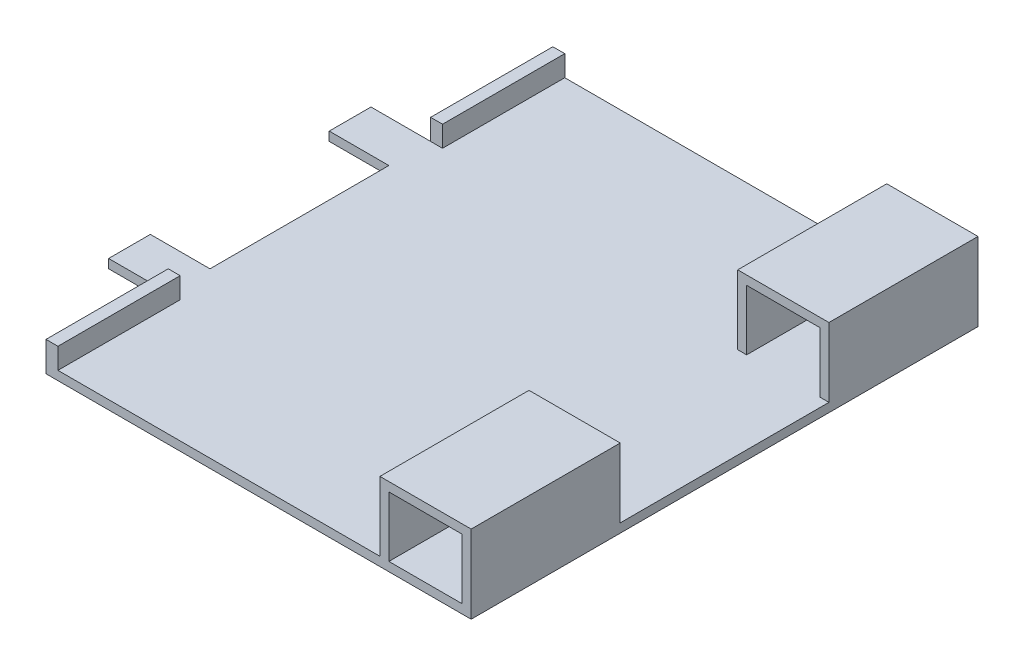
ISO-10303-21;
HEADER;
FILE_DESCRIPTION(('STEP AP214'),'2;1');
FILE_NAME('part.step','',(''),(''),'','','');
FILE_SCHEMA(('AUTOMOTIVE_DESIGN { 1 0 10303 214 1 1 1 1 }'));
ENDSEC;
DATA;
#1=APPLICATION_CONTEXT('core data for automotive mechanical design processes');
#2=APPLICATION_PROTOCOL_DEFINITION('international standard','automotive_design',2000,#1);
#3=PRODUCT_CONTEXT('',#1,'mechanical');
#4=PRODUCT('Part','Part','',(#3));
#5=PRODUCT_RELATED_PRODUCT_CATEGORY('part','',(#4));
#6=PRODUCT_DEFINITION_FORMATION('','',#4);
#7=PRODUCT_DEFINITION_CONTEXT('part definition',#1,'design');
#8=PRODUCT_DEFINITION('design','',#6,#7);
#9=PRODUCT_DEFINITION_SHAPE('','',#8);
#10=(LENGTH_UNIT() NAMED_UNIT(*) SI_UNIT(.MILLI.,.METRE.));
#11=(NAMED_UNIT(*) PLANE_ANGLE_UNIT() SI_UNIT($,.RADIAN.));
#12=(NAMED_UNIT(*) SI_UNIT($,.STERADIAN.) SOLID_ANGLE_UNIT());
#13=UNCERTAINTY_MEASURE_WITH_UNIT(LENGTH_MEASURE(1.E-05),#10,'distance_accuracy_value','');
#14=(GEOMETRIC_REPRESENTATION_CONTEXT(3) GLOBAL_UNCERTAINTY_ASSIGNED_CONTEXT((#13)) GLOBAL_UNIT_ASSIGNED_CONTEXT((#10,
#11,#12)) REPRESENTATION_CONTEXT('',''));
#15=CARTESIAN_POINT('',(0.,0.,0.));
#16=DIRECTION('',(0.,0.,1.));
#17=DIRECTION('',(1.,0.,0.));
#18=AXIS2_PLACEMENT_3D('',#15,#16,#17);
#19=CARTESIAN_POINT('',(0.,1.5,-5.49999999999999));
#20=DIRECTION('',(0.,0.,1.));
#21=DIRECTION('',(1.,0.,0.));
#22=AXIS2_PLACEMENT_3D('',#19,#20,#21);
#23=PLANE('',#22);
#24=DIRECTION('',(-1.,0.,0.));
#25=VECTOR('',#24,1.);
#26=CARTESIAN_POINT('',(0.,0.,-5.49999999999999));
#27=LINE('',#26,#25);
#28=CARTESIAN_POINT('',(-6.49999999999999,0.,-5.49999999999999));
#29=VERTEX_POINT('',#28);
#30=CARTESIAN_POINT('',(-16.5,0.,-5.5));
#31=VERTEX_POINT('',#30);
#32=EDGE_CURVE('E480',#29,#31,#27,.T.);
#33=ORIENTED_EDGE('',*,*,#32,.F.);
#34=DIRECTION('',(0.,-1.,0.));
#35=VECTOR('',#34,1.);
#36=CARTESIAN_POINT('',(-6.49999999999999,5.,-5.49999999999999));
#37=LINE('',#36,#35);
#38=CARTESIAN_POINT('',(-6.49999999999999,1.5,-5.49999999999999));
#39=VERTEX_POINT('',#38);
#40=EDGE_CURVE('E447',#39,#29,#37,.T.);
#41=ORIENTED_EDGE('',*,*,#40,.F.);
#42=DIRECTION('',(-1.,0.,0.));
#43=VECTOR('',#42,1.);
#44=CARTESIAN_POINT('',(0.,1.5,-5.49999999999999));
#45=LINE('',#44,#43);
#46=CARTESIAN_POINT('',(-16.5,1.5,-5.5));
#47=VERTEX_POINT('',#46);
#48=EDGE_CURVE('E510',#39,#47,#45,.T.);
#49=ORIENTED_EDGE('',*,*,#48,.T.);
#50=DIRECTION('',(0.,-1.,0.));
#51=VECTOR('',#50,1.);
#52=CARTESIAN_POINT('',(-16.5,1.5,-5.5));
#53=LINE('',#52,#51);
#54=EDGE_CURVE('E466',#47,#31,#53,.T.);
#55=ORIENTED_EDGE('',*,*,#54,.T.);
#56=EDGE_LOOP('',(#33,#41,#49,#55));
#57=FACE_BOUND('',#56,.T.);
#58=ADVANCED_FACE('F47',(#57),#23,.T.);
#59=CARTESIAN_POINT('',(0.,1.5,-49.5));
#60=DIRECTION('',(0.,0.,1.));
#61=DIRECTION('',(1.,0.,0.));
#62=AXIS2_PLACEMENT_3D('',#59,#60,#61);
#63=PLANE('',#62);
#64=DIRECTION('',(0.,-1.,0.));
#65=VECTOR('',#64,1.);
#66=CARTESIAN_POINT('',(-6.5,5.,-49.5));
#67=LINE('',#66,#65);
#68=CARTESIAN_POINT('',(-6.5,1.5,-49.5));
#69=VERTEX_POINT('',#68);
#70=CARTESIAN_POINT('',(-6.5,0.,-49.5));
#71=VERTEX_POINT('',#70);
#72=EDGE_CURVE('E69',#69,#71,#67,.T.);
#73=ORIENTED_EDGE('',*,*,#72,.T.);
#74=DIRECTION('',(-1.,0.,0.));
#75=VECTOR('',#74,1.);
#76=CARTESIAN_POINT('',(0.,0.,-49.5));
#77=LINE('',#76,#75);
#78=CARTESIAN_POINT('',(-16.5,0.,-49.5));
#79=VERTEX_POINT('',#78);
#80=EDGE_CURVE('E572',#71,#79,#77,.T.);
#81=ORIENTED_EDGE('',*,*,#80,.T.);
#82=DIRECTION('',(0.,-1.,0.));
#83=VECTOR('',#82,1.);
#84=CARTESIAN_POINT('',(-16.5,1.5,-49.5));
#85=LINE('',#84,#83);
#86=CARTESIAN_POINT('',(-16.5,1.5,-49.5));
#87=VERTEX_POINT('',#86);
#88=EDGE_CURVE('E476',#87,#79,#85,.T.);
#89=ORIENTED_EDGE('',*,*,#88,.F.);
#90=DIRECTION('',(-1.,0.,0.));
#91=VECTOR('',#90,1.);
#92=CARTESIAN_POINT('',(0.,1.5,-49.5));
#93=LINE('',#92,#91);
#94=EDGE_CURVE('E64',#69,#87,#93,.T.);
#95=ORIENTED_EDGE('',*,*,#94,.F.);
#96=EDGE_LOOP('',(#73,#81,#89,#95));
#97=FACE_BOUND('',#96,.T.);
#98=ADVANCED_FACE('F656',(#97),#63,.F.);
#99=CARTESIAN_POINT('',(-6.49999999999999,1.5,0.));
#100=DIRECTION('',(1.,0.,0.));
#101=DIRECTION('',(0.,0.,-1.));
#102=AXIS2_PLACEMENT_3D('',#99,#100,#101);
#103=PLANE('',#102);
#104=DIRECTION('',(0.,0.,1.));
#105=VECTOR('',#104,1.);
#106=CARTESIAN_POINT('',(-6.49999999999999,1.5,0.));
#107=LINE('',#106,#105);
#108=CARTESIAN_POINT('',(-6.5,1.5,-42.5));
#109=VERTEX_POINT('',#108);
#110=CARTESIAN_POINT('',(-6.5,1.5,-12.5));
#111=VERTEX_POINT('',#110);
#112=EDGE_CURVE('E11',#109,#111,#107,.T.);
#113=ORIENTED_EDGE('',*,*,#112,.F.);
#114=DIRECTION('',(0.,-1.,0.));
#115=VECTOR('',#114,1.);
#116=CARTESIAN_POINT('',(-6.5,1.5,-42.5));
#117=LINE('',#116,#115);
#118=CARTESIAN_POINT('',(-6.5,0.,-42.5));
#119=VERTEX_POINT('',#118);
#120=EDGE_CURVE('E462',#109,#119,#117,.T.);
#121=ORIENTED_EDGE('',*,*,#120,.T.);
#122=DIRECTION('',(0.,0.,1.));
#123=VECTOR('',#122,1.);
#124=CARTESIAN_POINT('',(-6.49999999999999,0.,0.));
#125=LINE('',#124,#123);
#126=CARTESIAN_POINT('',(-6.5,0.,-12.5));
#127=VERTEX_POINT('',#126);
#128=EDGE_CURVE('E50',#119,#127,#125,.T.);
#129=ORIENTED_EDGE('',*,*,#128,.T.);
#130=DIRECTION('',(0.,-1.,0.));
#131=VECTOR('',#130,1.);
#132=CARTESIAN_POINT('',(-6.5,1.5,-12.5));
#133=LINE('',#132,#131);
#134=EDGE_CURVE('E499',#111,#127,#133,.T.);
#135=ORIENTED_EDGE('',*,*,#134,.F.);
#136=EDGE_LOOP('',(#113,#121,#129,#135));
#137=FACE_BOUND('',#136,.T.);
#138=ADVANCED_FACE('F661',(#137),#103,.F.);
#139=CARTESIAN_POINT('',(0.,1.5,15.));
#140=DIRECTION('',(0.,0.,-1.));
#141=DIRECTION('',(-1.,0.,0.));
#142=AXIS2_PLACEMENT_3D('',#139,#140,#141);
#143=PLANE('',#142);
#144=DIRECTION('',(0.,-1.,0.));
#145=VECTOR('',#144,1.);
#146=CARTESIAN_POINT('',(51.,11.6,15.));
#147=LINE('',#146,#145);
#148=CARTESIAN_POINT('',(51.,11.6,15.));
#149=VERTEX_POINT('',#148);
#150=CARTESIAN_POINT('',(51.,1.5,15.));
#151=VERTEX_POINT('',#150);
#152=EDGE_CURVE('E375',#149,#151,#147,.T.);
#153=ORIENTED_EDGE('',*,*,#152,.F.);
#154=DIRECTION('',(1.,0.,0.));
#155=VECTOR('',#154,1.);
#156=CARTESIAN_POINT('',(49.5,11.6,15.));
#157=LINE('',#156,#155);
#158=CARTESIAN_POINT('',(63.3,11.6,15.));
#159=VERTEX_POINT('',#158);
#160=EDGE_CURVE('E294',#149,#159,#157,.T.);
#161=ORIENTED_EDGE('',*,*,#160,.T.);
#162=DIRECTION('',(0.,-1.,0.));
#163=VECTOR('',#162,1.);
#164=CARTESIAN_POINT('',(63.3,11.6,15.));
#165=LINE('',#164,#163);
#166=CARTESIAN_POINT('',(63.3,1.5,15.));
#167=VERTEX_POINT('',#166);
#168=EDGE_CURVE('E332',#159,#167,#165,.T.);
#169=ORIENTED_EDGE('',*,*,#168,.T.);
#170=DIRECTION('',(1.,0.,0.));
#171=VECTOR('',#170,1.);
#172=CARTESIAN_POINT('',(0.,1.5,15.));
#173=LINE('',#172,#171);
#174=EDGE_CURVE('E518',#151,#167,#173,.T.);
#175=ORIENTED_EDGE('',*,*,#174,.F.);
#176=EDGE_LOOP('',(#153,#161,#169,#175));
#177=FACE_BOUND('',#176,.T.);
#178=DIRECTION('',(1.,0.,0.));
#179=VECTOR('',#178,1.);
#180=CARTESIAN_POINT('',(0.,0.,15.));
#181=LINE('',#180,#179);
#182=CARTESIAN_POINT('',(-6.49999999999999,0.,15.));
#183=VERTEX_POINT('',#182);
#184=CARTESIAN_POINT('',(64.8,0.,15.));
#185=VERTEX_POINT('',#184);
#186=EDGE_CURVE('E563',#183,#185,#181,.T.);
#187=ORIENTED_EDGE('',*,*,#186,.T.);
#188=DIRECTION('',(0.,-1.,0.));
#189=VECTOR('',#188,1.);
#190=CARTESIAN_POINT('',(64.8,11.6,15.));
#191=LINE('',#190,#189);
#192=CARTESIAN_POINT('',(64.8,13.1,15.));
#193=VERTEX_POINT('',#192);
#194=EDGE_CURVE('E328',#193,#185,#191,.T.);
#195=ORIENTED_EDGE('',*,*,#194,.F.);
#196=DIRECTION('',(1.,0.,0.));
#197=VECTOR('',#196,1.);
#198=CARTESIAN_POINT('',(49.5,13.1,15.));
#199=LINE('',#198,#197);
#200=CARTESIAN_POINT('',(49.5,13.1,15.));
#201=VERTEX_POINT('',#200);
#202=EDGE_CURVE('E312',#201,#193,#199,.T.);
#203=ORIENTED_EDGE('',*,*,#202,.F.);
#204=DIRECTION('',(0.,-1.,0.));
#205=VECTOR('',#204,1.);
#206=CARTESIAN_POINT('',(49.5,11.6,15.));
#207=LINE('',#206,#205);
#208=CARTESIAN_POINT('',(49.5,1.5,15.));
#209=VERTEX_POINT('',#208);
#210=EDGE_CURVE('E378',#201,#209,#207,.T.);
#211=ORIENTED_EDGE('',*,*,#210,.T.);
#212=CARTESIAN_POINT('',(-4.49999999999999,1.5,15.));
#213=VERTEX_POINT('',#212);
#214=EDGE_CURVE('E513',#213,#209,#173,.T.);
#215=ORIENTED_EDGE('',*,*,#214,.F.);
#216=DIRECTION('',(0.,-1.,0.));
#217=VECTOR('',#216,1.);
#218=CARTESIAN_POINT('',(-4.49999999999999,5.,15.));
#219=LINE('',#218,#217);
#220=CARTESIAN_POINT('',(-4.49999999999999,5.,15.));
#221=VERTEX_POINT('',#220);
#222=EDGE_CURVE('E437',#221,#213,#219,.T.);
#223=ORIENTED_EDGE('',*,*,#222,.F.);
#224=DIRECTION('',(1.,0.,0.));
#225=VECTOR('',#224,1.);
#226=CARTESIAN_POINT('',(0.,5.,15.));
#227=LINE('',#226,#225);
#228=CARTESIAN_POINT('',(-6.49999999999999,5.,15.));
#229=VERTEX_POINT('',#228);
#230=EDGE_CURVE('E434',#229,#221,#227,.T.);
#231=ORIENTED_EDGE('',*,*,#230,.F.);
#232=DIRECTION('',(0.,-1.,0.));
#233=VECTOR('',#232,1.);
#234=CARTESIAN_POINT('',(-6.49999999999999,5.,15.));
#235=LINE('',#234,#233);
#236=EDGE_CURVE('E443',#229,#183,#235,.T.);
#237=ORIENTED_EDGE('',*,*,#236,.T.);
#238=EDGE_LOOP('',(#187,#195,#203,#211,#215,#223,#231,#237));
#239=FACE_BOUND('',#238,.T.);
#240=ADVANCED_FACE('F617',(#177,#239),#143,.F.);
#241=CARTESIAN_POINT('',(64.8,1.5,0.));
#242=DIRECTION('',(1.,0.,0.));
#243=DIRECTION('',(0.,0.,-1.));
#244=AXIS2_PLACEMENT_3D('',#241,#242,#243);
#245=PLANE('',#244);
#246=DIRECTION('',(0.,0.,1.));
#247=VECTOR('',#246,1.);
#248=CARTESIAN_POINT('',(64.8,0.,0.));
#249=LINE('',#248,#247);
#250=CARTESIAN_POINT('',(64.8,0.,-70.));
#251=VERTEX_POINT('',#250);
#252=EDGE_CURVE('E567',#251,#185,#249,.T.);
#253=ORIENTED_EDGE('',*,*,#252,.F.);
#254=DIRECTION('',(0.,-1.,0.));
#255=VECTOR('',#254,1.);
#256=CARTESIAN_POINT('',(64.8,11.6,-70.));
#257=LINE('',#256,#255);
#258=CARTESIAN_POINT('',(64.8,13.1,-70.));
#259=VERTEX_POINT('',#258);
#260=EDGE_CURVE('E346',#259,#251,#257,.T.);
#261=ORIENTED_EDGE('',*,*,#260,.F.);
#262=DIRECTION('',(0.,0.,-1.));
#263=VECTOR('',#262,1.);
#264=CARTESIAN_POINT('',(64.8,13.1,-70.));
#265=LINE('',#264,#263);
#266=CARTESIAN_POINT('',(64.8,13.1,-45.));
#267=VERTEX_POINT('',#266);
#268=EDGE_CURVE('E274',#267,#259,#265,.T.);
#269=ORIENTED_EDGE('',*,*,#268,.F.);
#270=DIRECTION('',(0.,-1.,0.));
#271=VECTOR('',#270,1.);
#272=CARTESIAN_POINT('',(64.8,11.6,-45.));
#273=LINE('',#272,#271);
#274=CARTESIAN_POINT('',(64.8,1.5,-45.));
#275=VERTEX_POINT('',#274);
#276=EDGE_CURVE('E269',#267,#275,#273,.T.);
#277=ORIENTED_EDGE('',*,*,#276,.T.);
#278=DIRECTION('',(0.,0.,1.));
#279=VECTOR('',#278,1.);
#280=CARTESIAN_POINT('',(64.8,1.5,0.));
#281=LINE('',#280,#279);
#282=CARTESIAN_POINT('',(64.8,1.5,-10.));
#283=VERTEX_POINT('',#282);
#284=EDGE_CURVE('E533',#275,#283,#281,.T.);
#285=ORIENTED_EDGE('',*,*,#284,.T.);
#286=DIRECTION('',(0.,-1.,0.));
#287=VECTOR('',#286,1.);
#288=CARTESIAN_POINT('',(64.8,11.6,-10.));
#289=LINE('',#288,#287);
#290=CARTESIAN_POINT('',(64.8,13.1,-10.));
#291=VERTEX_POINT('',#290);
#292=EDGE_CURVE('E323',#291,#283,#289,.T.);
#293=ORIENTED_EDGE('',*,*,#292,.F.);
#294=DIRECTION('',(0.,0.,-1.));
#295=VECTOR('',#294,1.);
#296=CARTESIAN_POINT('',(64.8,13.1,-10.));
#297=LINE('',#296,#295);
#298=EDGE_CURVE('E308',#193,#291,#297,.T.);
#299=ORIENTED_EDGE('',*,*,#298,.F.);
#300=ORIENTED_EDGE('',*,*,#194,.T.);
#301=EDGE_LOOP('',(#253,#261,#269,#277,#285,#293,#299,#300));
#302=FACE_BOUND('',#301,.T.);
#303=ADVANCED_FACE('F645',(#302),#245,.T.);
#304=CARTESIAN_POINT('',(0.,1.5,-70.));
#305=DIRECTION('',(0.,0.,-1.));
#306=DIRECTION('',(-1.,0.,0.));
#307=AXIS2_PLACEMENT_3D('',#304,#305,#306);
#308=PLANE('',#307);
#309=DIRECTION('',(-1.,0.,0.));
#310=VECTOR('',#309,1.);
#311=CARTESIAN_POINT('',(49.5,13.1,-70.));
#312=LINE('',#311,#310);
#313=CARTESIAN_POINT('',(49.5,13.1,-70.));
#314=VERTEX_POINT('',#313);
#315=EDGE_CURVE('E279',#259,#314,#312,.T.);
#316=ORIENTED_EDGE('',*,*,#315,.F.);
#317=ORIENTED_EDGE('',*,*,#260,.T.);
#318=DIRECTION('',(1.,0.,0.));
#319=VECTOR('',#318,1.);
#320=CARTESIAN_POINT('',(0.,0.,-70.));
#321=LINE('',#320,#319);
#322=CARTESIAN_POINT('',(-6.5,0.,-70.));
#323=VERTEX_POINT('',#322);
#324=EDGE_CURVE('E570',#323,#251,#321,.T.);
#325=ORIENTED_EDGE('',*,*,#324,.F.);
#326=DIRECTION('',(0.,-1.,0.));
#327=VECTOR('',#326,1.);
#328=CARTESIAN_POINT('',(-6.5,5.,-70.));
#329=LINE('',#328,#327);
#330=CARTESIAN_POINT('',(-6.5,5.,-70.));
#331=VERTEX_POINT('',#330);
#332=EDGE_CURVE('E411',#331,#323,#329,.T.);
#333=ORIENTED_EDGE('',*,*,#332,.F.);
#334=DIRECTION('',(1.,0.,0.));
#335=VECTOR('',#334,1.);
#336=CARTESIAN_POINT('',(0.,5.,-70.));
#337=LINE('',#336,#335);
#338=CARTESIAN_POINT('',(-4.49999999999999,5.,-70.));
#339=VERTEX_POINT('',#338);
#340=EDGE_CURVE('E396',#331,#339,#337,.T.);
#341=ORIENTED_EDGE('',*,*,#340,.T.);
#342=DIRECTION('',(0.,-1.,0.));
#343=VECTOR('',#342,1.);
#344=CARTESIAN_POINT('',(-4.49999999999999,5.,-70.));
#345=LINE('',#344,#343);
#346=CARTESIAN_POINT('',(-4.49999999999999,1.5,-70.));
#347=VERTEX_POINT('',#346);
#348=EDGE_CURVE('E415',#339,#347,#345,.T.);
#349=ORIENTED_EDGE('',*,*,#348,.T.);
#350=DIRECTION('',(1.,0.,0.));
#351=VECTOR('',#350,1.);
#352=CARTESIAN_POINT('',(0.,1.5,-70.));
#353=LINE('',#352,#351);
#354=CARTESIAN_POINT('',(49.5,1.5,-70.));
#355=VERTEX_POINT('',#354);
#356=EDGE_CURVE('E548',#347,#355,#353,.T.);
#357=ORIENTED_EDGE('',*,*,#356,.T.);
#358=DIRECTION('',(0.,-1.,0.));
#359=VECTOR('',#358,1.);
#360=CARTESIAN_POINT('',(49.5,11.6,-70.));
#361=LINE('',#360,#359);
#362=EDGE_CURVE('E358',#314,#355,#361,.T.);
#363=ORIENTED_EDGE('',*,*,#362,.F.);
#364=EDGE_LOOP('',(#316,#317,#325,#333,#341,#349,#357,#363));
#365=FACE_BOUND('',#364,.T.);
#366=DIRECTION('',(0.,-1.,0.));
#367=VECTOR('',#366,1.);
#368=CARTESIAN_POINT('',(63.3,11.6,-70.));
#369=LINE('',#368,#367);
#370=CARTESIAN_POINT('',(63.3,11.6,-70.));
#371=VERTEX_POINT('',#370);
#372=CARTESIAN_POINT('',(63.3,1.5,-70.));
#373=VERTEX_POINT('',#372);
#374=EDGE_CURVE('E343',#371,#373,#369,.T.);
#375=ORIENTED_EDGE('',*,*,#374,.F.);
#376=DIRECTION('',(-1.,0.,0.));
#377=VECTOR('',#376,1.);
#378=CARTESIAN_POINT('',(49.5,11.6,-70.));
#379=LINE('',#378,#377);
#380=CARTESIAN_POINT('',(51.,11.6,-70.));
#381=VERTEX_POINT('',#380);
#382=EDGE_CURVE('E281',#371,#381,#379,.T.);
#383=ORIENTED_EDGE('',*,*,#382,.T.);
#384=DIRECTION('',(0.,-1.,0.));
#385=VECTOR('',#384,1.);
#386=CARTESIAN_POINT('',(51.,11.6,-70.));
#387=LINE('',#386,#385);
#388=CARTESIAN_POINT('',(51.,1.5,-70.));
#389=VERTEX_POINT('',#388);
#390=EDGE_CURVE('E361',#381,#389,#387,.T.);
#391=ORIENTED_EDGE('',*,*,#390,.T.);
#392=EDGE_CURVE('E543',#389,#373,#353,.T.);
#393=ORIENTED_EDGE('',*,*,#392,.T.);
#394=EDGE_LOOP('',(#375,#383,#391,#393));
#395=FACE_BOUND('',#394,.T.);
#396=ADVANCED_FACE('F670',(#365,#395),#308,.T.);
#397=CARTESIAN_POINT('',(0.,1.5,0.));
#398=DIRECTION('',(0.,1.,0.));
#399=DIRECTION('',(0.,0.,1.));
#400=AXIS2_PLACEMENT_3D('',#397,#398,#399);
#401=PLANE('',#400);
#402=CARTESIAN_POINT('',(-4.49999999999999,1.5,-5.49999999999999));
#403=VERTEX_POINT('',#402);
#404=EDGE_CURVE('E506',#403,#39,#45,.T.);
#405=ORIENTED_EDGE('',*,*,#404,.F.);
#406=DIRECTION('',(0.,0.,-1.));
#407=VECTOR('',#406,1.);
#408=CARTESIAN_POINT('',(-4.49999999999999,1.5,0.));
#409=LINE('',#408,#407);
#410=EDGE_CURVE('E509',#213,#403,#409,.T.);
#411=ORIENTED_EDGE('',*,*,#410,.F.);
#412=ORIENTED_EDGE('',*,*,#214,.T.);
#413=DIRECTION('',(0.,0.,1.));
#414=VECTOR('',#413,1.);
#415=CARTESIAN_POINT('',(49.5,1.5,0.));
#416=LINE('',#415,#414);
#417=CARTESIAN_POINT('',(49.5,1.5,-10.));
#418=VERTEX_POINT('',#417);
#419=EDGE_CURVE('E517',#418,#209,#416,.T.);
#420=ORIENTED_EDGE('',*,*,#419,.F.);
#421=DIRECTION('',(-1.,0.,0.));
#422=VECTOR('',#421,1.);
#423=CARTESIAN_POINT('',(0.,1.5,-10.));
#424=LINE('',#423,#422);
#425=CARTESIAN_POINT('',(51.,1.5,-10.));
#426=VERTEX_POINT('',#425);
#427=EDGE_CURVE('E521',#426,#418,#424,.T.);
#428=ORIENTED_EDGE('',*,*,#427,.F.);
#429=DIRECTION('',(0.,0.,-1.));
#430=VECTOR('',#429,1.);
#431=CARTESIAN_POINT('',(51.,1.5,0.));
#432=LINE('',#431,#430);
#433=EDGE_CURVE('E524',#151,#426,#432,.T.);
#434=ORIENTED_EDGE('',*,*,#433,.F.);
#435=ORIENTED_EDGE('',*,*,#174,.T.);
#436=DIRECTION('',(0.,0.,-1.));
#437=VECTOR('',#436,1.);
#438=CARTESIAN_POINT('',(63.3,1.5,0.));
#439=LINE('',#438,#437);
#440=CARTESIAN_POINT('',(63.3,1.5,-10.));
#441=VERTEX_POINT('',#440);
#442=EDGE_CURVE('E527',#167,#441,#439,.T.);
#443=ORIENTED_EDGE('',*,*,#442,.T.);
#444=DIRECTION('',(1.,0.,0.));
#445=VECTOR('',#444,1.);
#446=CARTESIAN_POINT('',(0.,1.5,-10.));
#447=LINE('',#446,#445);
#448=EDGE_CURVE('E530',#441,#283,#447,.T.);
#449=ORIENTED_EDGE('',*,*,#448,.T.);
#450=ORIENTED_EDGE('',*,*,#284,.F.);
#451=DIRECTION('',(1.,0.,0.));
#452=VECTOR('',#451,1.);
#453=CARTESIAN_POINT('',(0.,1.5,-45.));
#454=LINE('',#453,#452);
#455=CARTESIAN_POINT('',(63.3,1.5,-45.));
#456=VERTEX_POINT('',#455);
#457=EDGE_CURVE('E537',#456,#275,#454,.T.);
#458=ORIENTED_EDGE('',*,*,#457,.F.);
#459=DIRECTION('',(0.,0.,1.));
#460=VECTOR('',#459,1.);
#461=CARTESIAN_POINT('',(63.3,1.5,0.));
#462=LINE('',#461,#460);
#463=EDGE_CURVE('E540',#373,#456,#462,.T.);
#464=ORIENTED_EDGE('',*,*,#463,.F.);
#465=ORIENTED_EDGE('',*,*,#392,.F.);
#466=DIRECTION('',(0.,0.,1.));
#467=VECTOR('',#466,1.);
#468=CARTESIAN_POINT('',(51.,1.5,0.));
#469=LINE('',#468,#467);
#470=CARTESIAN_POINT('',(51.,1.5,-45.));
#471=VERTEX_POINT('',#470);
#472=EDGE_CURVE('E547',#389,#471,#469,.T.);
#473=ORIENTED_EDGE('',*,*,#472,.T.);
#474=DIRECTION('',(1.,0.,0.));
#475=VECTOR('',#474,1.);
#476=CARTESIAN_POINT('',(0.,1.5,-45.));
#477=LINE('',#476,#475);
#478=CARTESIAN_POINT('',(49.5,1.5,-45.));
#479=VERTEX_POINT('',#478);
#480=EDGE_CURVE('E551',#479,#471,#477,.T.);
#481=ORIENTED_EDGE('',*,*,#480,.F.);
#482=DIRECTION('',(0.,0.,1.));
#483=VECTOR('',#482,1.);
#484=CARTESIAN_POINT('',(49.5,1.5,0.));
#485=LINE('',#484,#483);
#486=EDGE_CURVE('E258',#355,#479,#485,.T.);
#487=ORIENTED_EDGE('',*,*,#486,.F.);
#488=ORIENTED_EDGE('',*,*,#356,.F.);
#489=DIRECTION('',(0.,0.,1.));
#490=VECTOR('',#489,1.);
#491=CARTESIAN_POINT('',(-4.49999999999998,1.5,0.));
#492=LINE('',#491,#490);
#493=CARTESIAN_POINT('',(-4.49999999999999,1.5,-49.5));
#494=VERTEX_POINT('',#493);
#495=EDGE_CURVE('E556',#347,#494,#492,.T.);
#496=ORIENTED_EDGE('',*,*,#495,.T.);
#497=EDGE_CURVE('E56',#494,#69,#93,.T.);
#498=ORIENTED_EDGE('',*,*,#497,.T.);
#499=ORIENTED_EDGE('',*,*,#94,.T.);
#500=DIRECTION('',(0.,0.,1.));
#501=VECTOR('',#500,1.);
#502=CARTESIAN_POINT('',(-16.5,1.5,0.));
#503=LINE('',#502,#501);
#504=CARTESIAN_POINT('',(-16.5,1.5,-42.5));
#505=VERTEX_POINT('',#504);
#506=EDGE_CURVE('E455',#87,#505,#503,.T.);
#507=ORIENTED_EDGE('',*,*,#506,.T.);
#508=DIRECTION('',(1.,0.,0.));
#509=VECTOR('',#508,1.);
#510=CARTESIAN_POINT('',(0.,1.5,-42.5));
#511=LINE('',#510,#509);
#512=EDGE_CURVE('E458',#505,#109,#511,.T.);
#513=ORIENTED_EDGE('',*,*,#512,.T.);
#514=ORIENTED_EDGE('',*,*,#112,.T.);
#515=DIRECTION('',(1.,0.,0.));
#516=VECTOR('',#515,1.);
#517=CARTESIAN_POINT('',(0.,1.5,-12.5));
#518=LINE('',#517,#516);
#519=CARTESIAN_POINT('',(-16.5,1.5,-12.5));
#520=VERTEX_POINT('',#519);
#521=EDGE_CURVE('E485',#520,#111,#518,.T.);
#522=ORIENTED_EDGE('',*,*,#521,.F.);
#523=DIRECTION('',(0.,0.,-1.));
#524=VECTOR('',#523,1.);
#525=CARTESIAN_POINT('',(-16.5,1.5,0.));
#526=LINE('',#525,#524);
#527=EDGE_CURVE('E481',#47,#520,#526,.T.);
#528=ORIENTED_EDGE('',*,*,#527,.F.);
#529=ORIENTED_EDGE('',*,*,#48,.F.);
#530=EDGE_LOOP('',(#405,#411,#412,#420,#428,#434,#435,#443,#449,#450,#458,#464,#465,#473,#481,
#487,#488,#496,#498,#499,#507,#513,#514,#522,#528,#529));
#531=FACE_BOUND('',#530,.T.);
#532=ADVANCED_FACE('F591',(#531),#401,.T.);
#533=CARTESIAN_POINT('',(0.,0.,0.));
#534=DIRECTION('',(0.,1.,0.));
#535=DIRECTION('',(0.,0.,1.));
#536=AXIS2_PLACEMENT_3D('',#533,#534,#535);
#537=PLANE('',#536);
#538=ORIENTED_EDGE('',*,*,#252,.T.);
#539=ORIENTED_EDGE('',*,*,#186,.F.);
#540=DIRECTION('',(0.,0.,1.));
#541=VECTOR('',#540,1.);
#542=CARTESIAN_POINT('',(-6.49999999999999,0.,0.));
#543=LINE('',#542,#541);
#544=EDGE_CURVE('E386',#29,#183,#543,.T.);
#545=ORIENTED_EDGE('',*,*,#544,.F.);
#546=ORIENTED_EDGE('',*,*,#32,.T.);
#547=DIRECTION('',(0.,0.,-1.));
#548=VECTOR('',#547,1.);
#549=CARTESIAN_POINT('',(-16.5,0.,0.));
#550=LINE('',#549,#548);
#551=CARTESIAN_POINT('',(-16.5,0.,-12.5));
#552=VERTEX_POINT('',#551);
#553=EDGE_CURVE('E423',#31,#552,#550,.T.);
#554=ORIENTED_EDGE('',*,*,#553,.T.);
#555=DIRECTION('',(1.,0.,0.));
#556=VECTOR('',#555,1.);
#557=CARTESIAN_POINT('',(0.,0.,-12.5));
#558=LINE('',#557,#556);
#559=EDGE_CURVE('E486',#552,#127,#558,.T.);
#560=ORIENTED_EDGE('',*,*,#559,.T.);
#561=ORIENTED_EDGE('',*,*,#128,.F.);
#562=DIRECTION('',(1.,0.,0.));
#563=VECTOR('',#562,1.);
#564=CARTESIAN_POINT('',(0.,0.,-42.5));
#565=LINE('',#564,#563);
#566=CARTESIAN_POINT('',(-16.5,0.,-42.5));
#567=VERTEX_POINT('',#566);
#568=EDGE_CURVE('E459',#567,#119,#565,.T.);
#569=ORIENTED_EDGE('',*,*,#568,.F.);
#570=DIRECTION('',(0.,0.,1.));
#571=VECTOR('',#570,1.);
#572=CARTESIAN_POINT('',(-16.5,0.,0.));
#573=LINE('',#572,#571);
#574=EDGE_CURVE('E463',#79,#567,#573,.T.);
#575=ORIENTED_EDGE('',*,*,#574,.F.);
#576=ORIENTED_EDGE('',*,*,#80,.F.);
#577=DIRECTION('',(0.,0.,1.));
#578=VECTOR('',#577,1.);
#579=CARTESIAN_POINT('',(-6.49999999999999,0.,0.));
#580=LINE('',#579,#578);
#581=EDGE_CURVE('E392',#323,#71,#580,.T.);
#582=ORIENTED_EDGE('',*,*,#581,.F.);
#583=ORIENTED_EDGE('',*,*,#324,.T.);
#584=EDGE_LOOP('',(#538,#539,#545,#546,#554,#560,#561,#569,#575,#576,#582,#583));
#585=FACE_BOUND('',#584,.T.);
#586=ADVANCED_FACE('F597',(#585),#537,.F.);
#587=CARTESIAN_POINT('',(-16.5,1.5,0.));
#588=DIRECTION('',(-1.,0.,0.));
#589=DIRECTION('',(0.,0.,1.));
#590=AXIS2_PLACEMENT_3D('',#587,#588,#589);
#591=PLANE('',#590);
#592=ORIENTED_EDGE('',*,*,#553,.F.);
#593=ORIENTED_EDGE('',*,*,#54,.F.);
#594=ORIENTED_EDGE('',*,*,#527,.T.);
#595=DIRECTION('',(0.,-1.,0.));
#596=VECTOR('',#595,1.);
#597=CARTESIAN_POINT('',(-16.5,1.5,-12.5));
#598=LINE('',#597,#596);
#599=EDGE_CURVE('E490',#520,#552,#598,.T.);
#600=ORIENTED_EDGE('',*,*,#599,.T.);
#601=EDGE_LOOP('',(#592,#593,#594,#600));
#602=FACE_BOUND('',#601,.T.);
#603=ADVANCED_FACE('F589',(#602),#591,.T.);
#604=CARTESIAN_POINT('',(0.,1.5,-12.5));
#605=DIRECTION('',(0.,0.,-1.));
#606=DIRECTION('',(-1.,0.,0.));
#607=AXIS2_PLACEMENT_3D('',#604,#605,#606);
#608=PLANE('',#607);
#609=ORIENTED_EDGE('',*,*,#559,.F.);
#610=ORIENTED_EDGE('',*,*,#599,.F.);
#611=ORIENTED_EDGE('',*,*,#521,.T.);
#612=ORIENTED_EDGE('',*,*,#134,.T.);
#613=EDGE_LOOP('',(#609,#610,#611,#612));
#614=FACE_BOUND('',#613,.T.);
#615=ADVANCED_FACE('F595',(#614),#608,.T.);
#616=CARTESIAN_POINT('',(-16.5,1.5,0.));
#617=DIRECTION('',(1.,0.,0.));
#618=DIRECTION('',(0.,0.,-1.));
#619=AXIS2_PLACEMENT_3D('',#616,#617,#618);
#620=PLANE('',#619);
#621=ORIENTED_EDGE('',*,*,#574,.T.);
#622=DIRECTION('',(0.,-1.,0.));
#623=VECTOR('',#622,1.);
#624=CARTESIAN_POINT('',(-16.5,1.5,-42.5));
#625=LINE('',#624,#623);
#626=EDGE_CURVE('E472',#505,#567,#625,.T.);
#627=ORIENTED_EDGE('',*,*,#626,.F.);
#628=ORIENTED_EDGE('',*,*,#506,.F.);
#629=ORIENTED_EDGE('',*,*,#88,.T.);
#630=EDGE_LOOP('',(#621,#627,#628,#629));
#631=FACE_BOUND('',#630,.T.);
#632=ADVANCED_FACE('F891',(#631),#620,.F.);
#633=CARTESIAN_POINT('',(0.,1.5,-42.5));
#634=DIRECTION('',(0.,0.,-1.));
#635=DIRECTION('',(-1.,0.,0.));
#636=AXIS2_PLACEMENT_3D('',#633,#634,#635);
#637=PLANE('',#636);
#638=ORIENTED_EDGE('',*,*,#568,.T.);
#639=ORIENTED_EDGE('',*,*,#120,.F.);
#640=ORIENTED_EDGE('',*,*,#512,.F.);
#641=ORIENTED_EDGE('',*,*,#626,.T.);
#642=EDGE_LOOP('',(#638,#639,#640,#641));
#643=FACE_BOUND('',#642,.T.);
#644=ADVANCED_FACE('F871',(#643),#637,.F.);
#645=CARTESIAN_POINT('',(-4.49999999999999,5.,0.));
#646=DIRECTION('',(-1.,0.,0.));
#647=DIRECTION('',(0.,0.,1.));
#648=AXIS2_PLACEMENT_3D('',#645,#646,#647);
#649=PLANE('',#648);
#650=ORIENTED_EDGE('',*,*,#410,.T.);
#651=DIRECTION('',(0.,-1.,0.));
#652=VECTOR('',#651,1.);
#653=CARTESIAN_POINT('',(-4.49999999999999,5.,-5.49999999999999));
#654=LINE('',#653,#652);
#655=CARTESIAN_POINT('',(-4.49999999999999,5.,-5.49999999999999));
#656=VERTEX_POINT('',#655);
#657=EDGE_CURVE('E406',#656,#403,#654,.T.);
#658=ORIENTED_EDGE('',*,*,#657,.F.);
#659=DIRECTION('',(0.,0.,-1.));
#660=VECTOR('',#659,1.);
#661=CARTESIAN_POINT('',(-4.49999999999999,5.,0.));
#662=LINE('',#661,#660);
#663=EDGE_CURVE('E424',#221,#656,#662,.T.);
#664=ORIENTED_EDGE('',*,*,#663,.F.);
#665=ORIENTED_EDGE('',*,*,#222,.T.);
#666=EDGE_LOOP('',(#650,#658,#664,#665));
#667=FACE_BOUND('',#666,.T.);
#668=ADVANCED_FACE('F612',(#667),#649,.F.);
#669=CARTESIAN_POINT('',(0.,5.,-5.49999999999999));
#670=DIRECTION('',(0.,0.,1.));
#671=DIRECTION('',(1.,0.,0.));
#672=AXIS2_PLACEMENT_3D('',#669,#670,#671);
#673=PLANE('',#672);
#674=ORIENTED_EDGE('',*,*,#404,.T.);
#675=CARTESIAN_POINT('',(-6.49999999999999,5.,-5.49999999999999));
#676=VERTEX_POINT('',#675);
#677=EDGE_CURVE('E448',#676,#39,#37,.T.);
#678=ORIENTED_EDGE('',*,*,#677,.F.);
#679=DIRECTION('',(-1.,0.,0.));
#680=VECTOR('',#679,1.);
#681=CARTESIAN_POINT('',(0.,5.,-5.49999999999999));
#682=LINE('',#681,#680);
#683=EDGE_CURVE('E428',#656,#676,#682,.T.);
#684=ORIENTED_EDGE('',*,*,#683,.F.);
#685=ORIENTED_EDGE('',*,*,#657,.T.);
#686=EDGE_LOOP('',(#674,#678,#684,#685));
#687=FACE_BOUND('',#686,.T.);
#688=ADVANCED_FACE('F606',(#687),#673,.F.);
#689=CARTESIAN_POINT('',(-6.49999999999999,5.,0.));
#690=DIRECTION('',(1.,0.,0.));
#691=DIRECTION('',(0.,0.,-1.));
#692=AXIS2_PLACEMENT_3D('',#689,#690,#691);
#693=PLANE('',#692);
#694=ORIENTED_EDGE('',*,*,#544,.T.);
#695=ORIENTED_EDGE('',*,*,#236,.F.);
#696=DIRECTION('',(0.,0.,1.));
#697=VECTOR('',#696,1.);
#698=CARTESIAN_POINT('',(-6.49999999999999,5.,0.));
#699=LINE('',#698,#697);
#700=EDGE_CURVE('E431',#676,#229,#699,.T.);
#701=ORIENTED_EDGE('',*,*,#700,.F.);
#702=ORIENTED_EDGE('',*,*,#677,.T.);
#703=ORIENTED_EDGE('',*,*,#40,.T.);
#704=EDGE_LOOP('',(#694,#695,#701,#702,#703));
#705=FACE_BOUND('',#704,.T.);
#706=ADVANCED_FACE('F600',(#705),#693,.F.);
#707=CARTESIAN_POINT('',(0.,5.,0.));
#708=DIRECTION('',(0.,1.,0.));
#709=DIRECTION('',(0.,0.,1.));
#710=AXIS2_PLACEMENT_3D('',#707,#708,#709);
#711=PLANE('',#710);
#712=ORIENTED_EDGE('',*,*,#663,.T.);
#713=ORIENTED_EDGE('',*,*,#683,.T.);
#714=ORIENTED_EDGE('',*,*,#700,.T.);
#715=ORIENTED_EDGE('',*,*,#230,.T.);
#716=EDGE_LOOP('',(#712,#713,#714,#715));
#717=FACE_BOUND('',#716,.T.);
#718=ADVANCED_FACE('F840',(#717),#711,.T.);
#719=CARTESIAN_POINT('',(0.,5.,-49.5));
#720=DIRECTION('',(0.,0.,1.));
#721=DIRECTION('',(1.,0.,0.));
#722=AXIS2_PLACEMENT_3D('',#719,#720,#721);
#723=PLANE('',#722);
#724=CARTESIAN_POINT('',(-6.5,5.,-49.5));
#725=VERTEX_POINT('',#724);
#726=EDGE_CURVE('E407',#725,#69,#67,.T.);
#727=ORIENTED_EDGE('',*,*,#726,.T.);
#728=ORIENTED_EDGE('',*,*,#497,.F.);
#729=DIRECTION('',(0.,-1.,0.));
#730=VECTOR('',#729,1.);
#731=CARTESIAN_POINT('',(-4.49999999999999,5.,-49.5));
#732=LINE('',#731,#730);
#733=CARTESIAN_POINT('',(-4.49999999999999,5.,-49.5));
#734=VERTEX_POINT('',#733);
#735=EDGE_CURVE('E419',#734,#494,#732,.T.);
#736=ORIENTED_EDGE('',*,*,#735,.F.);
#737=DIRECTION('',(-1.,0.,0.));
#738=VECTOR('',#737,1.);
#739=CARTESIAN_POINT('',(0.,5.,-49.5));
#740=LINE('',#739,#738);
#741=EDGE_CURVE('E387',#734,#725,#740,.T.);
#742=ORIENTED_EDGE('',*,*,#741,.T.);
#743=EDGE_LOOP('',(#727,#728,#736,#742));
#744=FACE_BOUND('',#743,.T.);
#745=ADVANCED_FACE('F831',(#744),#723,.T.);
#746=CARTESIAN_POINT('',(-4.49999999999998,5.,0.));
#747=DIRECTION('',(1.,0.,0.));
#748=DIRECTION('',(0.,0.,-1.));
#749=AXIS2_PLACEMENT_3D('',#746,#747,#748);
#750=PLANE('',#749);
#751=ORIENTED_EDGE('',*,*,#735,.T.);
#752=ORIENTED_EDGE('',*,*,#495,.F.);
#753=ORIENTED_EDGE('',*,*,#348,.F.);
#754=DIRECTION('',(0.,0.,1.));
#755=VECTOR('',#754,1.);
#756=CARTESIAN_POINT('',(-4.49999999999998,5.,0.));
#757=LINE('',#756,#755);
#758=EDGE_CURVE('E391',#339,#734,#757,.T.);
#759=ORIENTED_EDGE('',*,*,#758,.T.);
#760=EDGE_LOOP('',(#751,#752,#753,#759));
#761=FACE_BOUND('',#760,.T.);
#762=ADVANCED_FACE('F821',(#761),#750,.T.);
#763=CARTESIAN_POINT('',(-6.49999999999999,5.,0.));
#764=DIRECTION('',(1.,0.,0.));
#765=DIRECTION('',(0.,0.,-1.));
#766=AXIS2_PLACEMENT_3D('',#763,#764,#765);
#767=PLANE('',#766);
#768=ORIENTED_EDGE('',*,*,#581,.T.);
#769=ORIENTED_EDGE('',*,*,#72,.F.);
#770=ORIENTED_EDGE('',*,*,#726,.F.);
#771=DIRECTION('',(0.,0.,1.));
#772=VECTOR('',#771,1.);
#773=CARTESIAN_POINT('',(-6.49999999999999,5.,0.));
#774=LINE('',#773,#772);
#775=EDGE_CURVE('E400',#331,#725,#774,.T.);
#776=ORIENTED_EDGE('',*,*,#775,.F.);
#777=ORIENTED_EDGE('',*,*,#332,.T.);
#778=EDGE_LOOP('',(#768,#769,#770,#776,#777));
#779=FACE_BOUND('',#778,.T.);
#780=ADVANCED_FACE('F810',(#779),#767,.F.);
#781=CARTESIAN_POINT('',(0.,5.,0.));
#782=DIRECTION('',(0.,1.,0.));
#783=DIRECTION('',(0.,0.,1.));
#784=AXIS2_PLACEMENT_3D('',#781,#782,#783);
#785=PLANE('',#784);
#786=ORIENTED_EDGE('',*,*,#741,.F.);
#787=ORIENTED_EDGE('',*,*,#758,.F.);
#788=ORIENTED_EDGE('',*,*,#340,.F.);
#789=ORIENTED_EDGE('',*,*,#775,.T.);
#790=EDGE_LOOP('',(#786,#787,#788,#789));
#791=FACE_BOUND('',#790,.T.);
#792=ADVANCED_FACE('F700',(#791),#785,.T.);
#793=CARTESIAN_POINT('',(49.5,11.6,0.));
#794=DIRECTION('',(1.,0.,0.));
#795=DIRECTION('',(0.,0.,-1.));
#796=AXIS2_PLACEMENT_3D('',#793,#794,#795);
#797=PLANE('',#796);
#798=ORIENTED_EDGE('',*,*,#419,.T.);
#799=ORIENTED_EDGE('',*,*,#210,.F.);
#800=DIRECTION('',(0.,0.,1.));
#801=VECTOR('',#800,1.);
#802=CARTESIAN_POINT('',(49.5,13.1,-10.));
#803=LINE('',#802,#801);
#804=CARTESIAN_POINT('',(49.5,13.1,-10.));
#805=VERTEX_POINT('',#804);
#806=EDGE_CURVE('E300',#805,#201,#803,.T.);
#807=ORIENTED_EDGE('',*,*,#806,.F.);
#808=DIRECTION('',(0.,-1.,0.));
#809=VECTOR('',#808,1.);
#810=CARTESIAN_POINT('',(49.5,11.6,-10.));
#811=LINE('',#810,#809);
#812=EDGE_CURVE('E382',#805,#418,#811,.T.);
#813=ORIENTED_EDGE('',*,*,#812,.T.);
#814=EDGE_LOOP('',(#798,#799,#807,#813));
#815=FACE_BOUND('',#814,.T.);
#816=ADVANCED_FACE('F621',(#815),#797,.F.);
#817=CARTESIAN_POINT('',(51.,11.6,0.));
#818=DIRECTION('',(-1.,0.,0.));
#819=DIRECTION('',(0.,0.,1.));
#820=AXIS2_PLACEMENT_3D('',#817,#818,#819);
#821=PLANE('',#820);
#822=ORIENTED_EDGE('',*,*,#433,.T.);
#823=DIRECTION('',(0.,-1.,0.));
#824=VECTOR('',#823,1.);
#825=CARTESIAN_POINT('',(51.,11.6,-10.));
#826=LINE('',#825,#824);
#827=CARTESIAN_POINT('',(51.,11.6,-10.));
#828=VERTEX_POINT('',#827);
#829=EDGE_CURVE('E371',#828,#426,#826,.T.);
#830=ORIENTED_EDGE('',*,*,#829,.F.);
#831=DIRECTION('',(0.,0.,-1.));
#832=VECTOR('',#831,1.);
#833=CARTESIAN_POINT('',(51.,11.6,0.));
#834=LINE('',#833,#832);
#835=EDGE_CURVE('E340',#149,#828,#834,.T.);
#836=ORIENTED_EDGE('',*,*,#835,.F.);
#837=ORIENTED_EDGE('',*,*,#152,.T.);
#838=EDGE_LOOP('',(#822,#830,#836,#837));
#839=FACE_BOUND('',#838,.T.);
#840=ADVANCED_FACE('F630',(#839),#821,.F.);
#841=CARTESIAN_POINT('',(0.,11.6,-10.));
#842=DIRECTION('',(0.,0.,-1.));
#843=DIRECTION('',(-1.,0.,0.));
#844=AXIS2_PLACEMENT_3D('',#841,#842,#843);
#845=PLANE('',#844);
#846=ORIENTED_EDGE('',*,*,#292,.T.);
#847=ORIENTED_EDGE('',*,*,#448,.F.);
#848=DIRECTION('',(0.,-1.,0.));
#849=VECTOR('',#848,1.);
#850=CARTESIAN_POINT('',(63.3,11.6,-10.));
#851=LINE('',#850,#849);
#852=CARTESIAN_POINT('',(63.3,11.6,-10.));
#853=VERTEX_POINT('',#852);
#854=EDGE_CURVE('E336',#853,#441,#851,.T.);
#855=ORIENTED_EDGE('',*,*,#854,.F.);
#856=DIRECTION('',(-1.,0.,0.));
#857=VECTOR('',#856,1.);
#858=CARTESIAN_POINT('',(49.5,11.6,-10.));
#859=LINE('',#858,#857);
#860=EDGE_CURVE('E296',#853,#828,#859,.T.);
#861=ORIENTED_EDGE('',*,*,#860,.T.);
#862=ORIENTED_EDGE('',*,*,#829,.T.);
#863=ORIENTED_EDGE('',*,*,#427,.T.);
#864=ORIENTED_EDGE('',*,*,#812,.F.);
#865=DIRECTION('',(-1.,0.,0.));
#866=VECTOR('',#865,1.);
#867=CARTESIAN_POINT('',(49.5,13.1,-10.));
#868=LINE('',#867,#866);
#869=EDGE_CURVE('E304',#291,#805,#868,.T.);
#870=ORIENTED_EDGE('',*,*,#869,.F.);
#871=EDGE_LOOP('',(#846,#847,#855,#861,#862,#863,#864,#870));
#872=FACE_BOUND('',#871,.T.);
#873=ADVANCED_FACE('F625',(#872),#845,.T.);
#874=CARTESIAN_POINT('',(63.3,11.6,0.));
#875=DIRECTION('',(-1.,0.,0.));
#876=DIRECTION('',(0.,0.,1.));
#877=AXIS2_PLACEMENT_3D('',#874,#875,#876);
#878=PLANE('',#877);
#879=ORIENTED_EDGE('',*,*,#854,.T.);
#880=ORIENTED_EDGE('',*,*,#442,.F.);
#881=ORIENTED_EDGE('',*,*,#168,.F.);
#882=DIRECTION('',(0.,0.,-1.));
#883=VECTOR('',#882,1.);
#884=CARTESIAN_POINT('',(63.3,11.6,0.));
#885=LINE('',#884,#883);
#886=EDGE_CURVE('E319',#159,#853,#885,.T.);
#887=ORIENTED_EDGE('',*,*,#886,.T.);
#888=EDGE_LOOP('',(#879,#880,#881,#887));
#889=FACE_BOUND('',#888,.T.);
#890=ADVANCED_FACE('F639',(#889),#878,.T.);
#891=CARTESIAN_POINT('',(63.3,11.6,0.));
#892=DIRECTION('',(1.,0.,0.));
#893=DIRECTION('',(0.,0.,-1.));
#894=AXIS2_PLACEMENT_3D('',#891,#892,#893);
#895=PLANE('',#894);
#896=ORIENTED_EDGE('',*,*,#463,.T.);
#897=DIRECTION('',(0.,-1.,0.));
#898=VECTOR('',#897,1.);
#899=CARTESIAN_POINT('',(63.3,11.6,-45.));
#900=LINE('',#899,#898);
#901=CARTESIAN_POINT('',(63.3,11.6,-45.));
#902=VERTEX_POINT('',#901);
#903=EDGE_CURVE('E324',#902,#456,#900,.T.);
#904=ORIENTED_EDGE('',*,*,#903,.F.);
#905=DIRECTION('',(0.,0.,1.));
#906=VECTOR('',#905,1.);
#907=CARTESIAN_POINT('',(63.3,11.6,0.));
#908=LINE('',#907,#906);
#909=EDGE_CURVE('E262',#371,#902,#908,.T.);
#910=ORIENTED_EDGE('',*,*,#909,.F.);
#911=ORIENTED_EDGE('',*,*,#374,.T.);
#912=EDGE_LOOP('',(#896,#904,#910,#911));
#913=FACE_BOUND('',#912,.T.);
#914=ADVANCED_FACE('F723',(#913),#895,.F.);
#915=CARTESIAN_POINT('',(49.5,11.6,0.));
#916=DIRECTION('',(1.,0.,0.));
#917=DIRECTION('',(0.,0.,-1.));
#918=AXIS2_PLACEMENT_3D('',#915,#916,#917);
#919=PLANE('',#918);
#920=ORIENTED_EDGE('',*,*,#486,.T.);
#921=DIRECTION('',(0.,-1.,0.));
#922=VECTOR('',#921,1.);
#923=CARTESIAN_POINT('',(49.5,11.6,-45.));
#924=LINE('',#923,#922);
#925=CARTESIAN_POINT('',(49.5,13.1,-45.));
#926=VERTEX_POINT('',#925);
#927=EDGE_CURVE('E252',#926,#479,#924,.T.);
#928=ORIENTED_EDGE('',*,*,#927,.F.);
#929=DIRECTION('',(0.,0.,1.));
#930=VECTOR('',#929,1.);
#931=CARTESIAN_POINT('',(49.5,13.1,-70.));
#932=LINE('',#931,#930);
#933=EDGE_CURVE('E257',#314,#926,#932,.T.);
#934=ORIENTED_EDGE('',*,*,#933,.F.);
#935=ORIENTED_EDGE('',*,*,#362,.T.);
#936=EDGE_LOOP('',(#920,#928,#934,#935));
#937=FACE_BOUND('',#936,.T.);
#938=ADVANCED_FACE('F254',(#937),#919,.F.);
#939=CARTESIAN_POINT('',(0.,11.6,-45.));
#940=DIRECTION('',(0.,0.,-1.));
#941=DIRECTION('',(-1.,0.,0.));
#942=AXIS2_PLACEMENT_3D('',#939,#940,#941);
#943=PLANE('',#942);
#944=ORIENTED_EDGE('',*,*,#480,.T.);
#945=DIRECTION('',(0.,-1.,0.));
#946=VECTOR('',#945,1.);
#947=CARTESIAN_POINT('',(51.,11.6,-45.));
#948=LINE('',#947,#946);
#949=CARTESIAN_POINT('',(51.,11.6,-45.));
#950=VERTEX_POINT('',#949);
#951=EDGE_CURVE('E263',#950,#471,#948,.T.);
#952=ORIENTED_EDGE('',*,*,#951,.F.);
#953=DIRECTION('',(1.,0.,0.));
#954=VECTOR('',#953,1.);
#955=CARTESIAN_POINT('',(49.5,11.6,-45.));
#956=LINE('',#955,#954);
#957=EDGE_CURVE('E284',#950,#902,#956,.T.);
#958=ORIENTED_EDGE('',*,*,#957,.T.);
#959=ORIENTED_EDGE('',*,*,#903,.T.);
#960=ORIENTED_EDGE('',*,*,#457,.T.);
#961=ORIENTED_EDGE('',*,*,#276,.F.);
#962=DIRECTION('',(1.,0.,0.));
#963=VECTOR('',#962,1.);
#964=CARTESIAN_POINT('',(49.5,13.1,-45.));
#965=LINE('',#964,#963);
#966=EDGE_CURVE('E266',#926,#267,#965,.T.);
#967=ORIENTED_EDGE('',*,*,#966,.F.);
#968=ORIENTED_EDGE('',*,*,#927,.T.);
#969=EDGE_LOOP('',(#944,#952,#958,#959,#960,#961,#967,#968));
#970=FACE_BOUND('',#969,.T.);
#971=ADVANCED_FACE('F267',(#970),#943,.F.);
#972=CARTESIAN_POINT('',(51.,11.6,0.));
#973=DIRECTION('',(1.,0.,0.));
#974=DIRECTION('',(0.,0.,-1.));
#975=AXIS2_PLACEMENT_3D('',#972,#973,#974);
#976=PLANE('',#975);
#977=ORIENTED_EDGE('',*,*,#951,.T.);
#978=ORIENTED_EDGE('',*,*,#472,.F.);
#979=ORIENTED_EDGE('',*,*,#390,.F.);
#980=DIRECTION('',(0.,0.,1.));
#981=VECTOR('',#980,1.);
#982=CARTESIAN_POINT('',(51.,11.6,0.));
#983=LINE('',#982,#981);
#984=EDGE_CURVE('E291',#381,#950,#983,.T.);
#985=ORIENTED_EDGE('',*,*,#984,.T.);
#986=EDGE_LOOP('',(#977,#978,#979,#985));
#987=FACE_BOUND('',#986,.T.);
#988=ADVANCED_FACE('F744',(#987),#976,.T.);
#989=CARTESIAN_POINT('',(0.,11.6,0.));
#990=DIRECTION('',(0.,1.,0.));
#991=DIRECTION('',(0.,0.,1.));
#992=AXIS2_PLACEMENT_3D('',#989,#990,#991);
#993=PLANE('',#992);
#994=ORIENTED_EDGE('',*,*,#382,.F.);
#995=ORIENTED_EDGE('',*,*,#909,.T.);
#996=ORIENTED_EDGE('',*,*,#957,.F.);
#997=ORIENTED_EDGE('',*,*,#984,.F.);
#998=EDGE_LOOP('',(#994,#995,#996,#997));
#999=FACE_BOUND('',#998,.T.);
#1000=ADVANCED_FACE('F753',(#999),#993,.F.);
#1001=CARTESIAN_POINT('',(0.,13.1,0.));
#1002=DIRECTION('',(0.,1.,0.));
#1003=DIRECTION('',(0.,0.,1.));
#1004=AXIS2_PLACEMENT_3D('',#1001,#1002,#1003);
#1005=PLANE('',#1004);
#1006=ORIENTED_EDGE('',*,*,#933,.T.);
#1007=ORIENTED_EDGE('',*,*,#966,.T.);
#1008=ORIENTED_EDGE('',*,*,#268,.T.);
#1009=ORIENTED_EDGE('',*,*,#315,.T.);
#1010=EDGE_LOOP('',(#1006,#1007,#1008,#1009));
#1011=FACE_BOUND('',#1010,.T.);
#1012=ADVANCED_FACE('F277',(#1011),#1005,.T.);
#1013=CARTESIAN_POINT('',(0.,11.6,0.));
#1014=DIRECTION('',(0.,1.,0.));
#1015=DIRECTION('',(0.,0.,1.));
#1016=AXIS2_PLACEMENT_3D('',#1013,#1014,#1015);
#1017=PLANE('',#1016);
#1018=ORIENTED_EDGE('',*,*,#160,.F.);
#1019=ORIENTED_EDGE('',*,*,#835,.T.);
#1020=ORIENTED_EDGE('',*,*,#860,.F.);
#1021=ORIENTED_EDGE('',*,*,#886,.F.);
#1022=EDGE_LOOP('',(#1018,#1019,#1020,#1021));
#1023=FACE_BOUND('',#1022,.T.);
#1024=ADVANCED_FACE('F633',(#1023),#1017,.F.);
#1025=CARTESIAN_POINT('',(0.,13.1,0.));
#1026=DIRECTION('',(0.,1.,0.));
#1027=DIRECTION('',(0.,0.,1.));
#1028=AXIS2_PLACEMENT_3D('',#1025,#1026,#1027);
#1029=PLANE('',#1028);
#1030=ORIENTED_EDGE('',*,*,#806,.T.);
#1031=ORIENTED_EDGE('',*,*,#202,.T.);
#1032=ORIENTED_EDGE('',*,*,#298,.T.);
#1033=ORIENTED_EDGE('',*,*,#869,.T.);
#1034=EDGE_LOOP('',(#1030,#1031,#1032,#1033));
#1035=FACE_BOUND('',#1034,.T.);
#1036=ADVANCED_FACE('F647',(#1035),#1029,.T.);
#1037=CLOSED_SHELL('',(#58,#98,#138,#240,#303,#396,#532,#586,#603,#615,#632,#644,#668,#688,#706,
#718,#745,#762,#780,#792,#816,#840,#873,#890,#914,#938,#971,#988,#1000,#1012,#1024,#1036));
#1038=MANIFOLD_SOLID_BREP('B2',#1037);
#1039=ADVANCED_BREP_SHAPE_REPRESENTATION('',(#18,#1038),#14);
#1040=SHAPE_DEFINITION_REPRESENTATION(#9,#1039);
ENDSEC;
END-ISO-10303-21;
